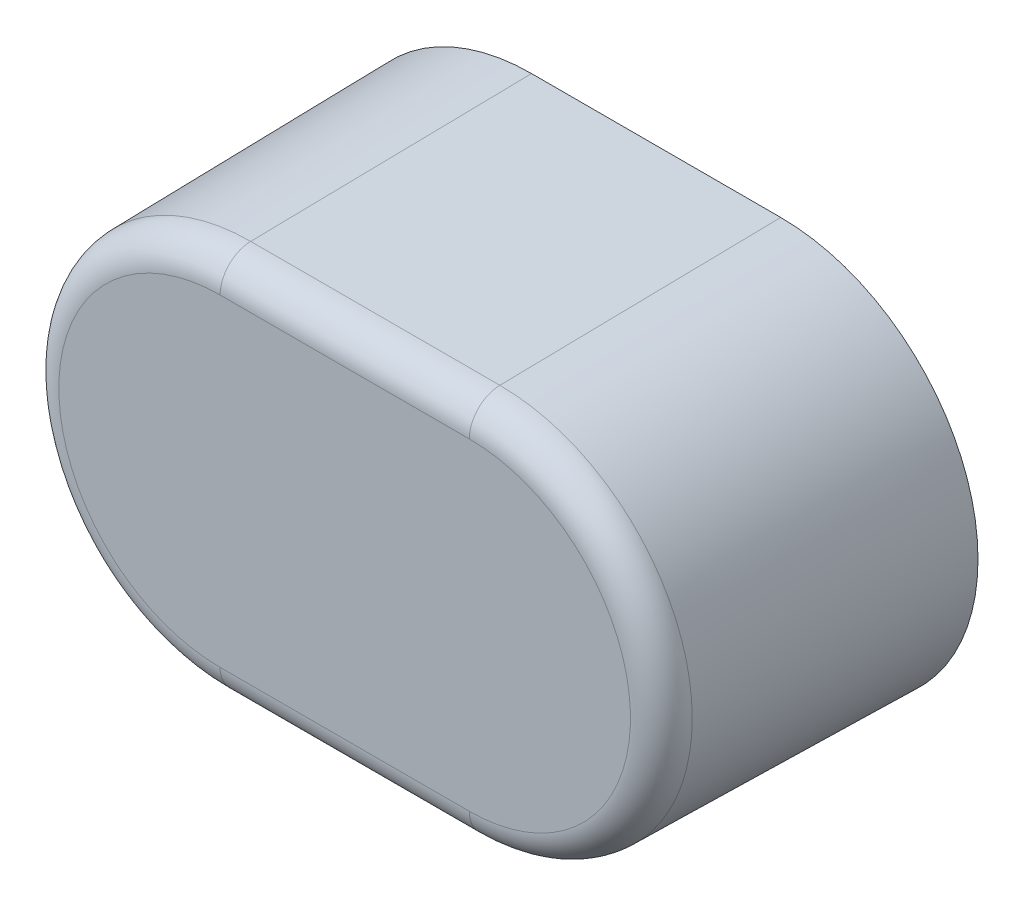
ISO-10303-21;
HEADER;
FILE_DESCRIPTION(('STEP AP214'),'2;1');
FILE_NAME('part.step','',(''),(''),'','','');
FILE_SCHEMA(('AUTOMOTIVE_DESIGN { 1 0 10303 214 1 1 1 1 }'));
ENDSEC;
DATA;
#1=APPLICATION_CONTEXT('core data for automotive mechanical design processes');
#2=APPLICATION_PROTOCOL_DEFINITION('international standard','automotive_design',2000,#1);
#3=PRODUCT_CONTEXT('',#1,'mechanical');
#4=PRODUCT('Part','Part','',(#3));
#5=PRODUCT_RELATED_PRODUCT_CATEGORY('part','',(#4));
#6=PRODUCT_DEFINITION_FORMATION('','',#4);
#7=PRODUCT_DEFINITION_CONTEXT('part definition',#1,'design');
#8=PRODUCT_DEFINITION('design','',#6,#7);
#9=PRODUCT_DEFINITION_SHAPE('','',#8);
#10=(LENGTH_UNIT() NAMED_UNIT(*) SI_UNIT(.MILLI.,.METRE.));
#11=(NAMED_UNIT(*) PLANE_ANGLE_UNIT() SI_UNIT($,.RADIAN.));
#12=(NAMED_UNIT(*) SI_UNIT($,.STERADIAN.) SOLID_ANGLE_UNIT());
#13=UNCERTAINTY_MEASURE_WITH_UNIT(LENGTH_MEASURE(1.E-05),#10,'distance_accuracy_value','');
#14=(GEOMETRIC_REPRESENTATION_CONTEXT(3) GLOBAL_UNCERTAINTY_ASSIGNED_CONTEXT((#13)) GLOBAL_UNIT_ASSIGNED_CONTEXT((#10,
#11,#12)) REPRESENTATION_CONTEXT('',''));
#15=CARTESIAN_POINT('',(0.,0.,0.));
#16=DIRECTION('',(0.,0.,1.));
#17=DIRECTION('',(1.,0.,0.));
#18=AXIS2_PLACEMENT_3D('',#15,#16,#17);
#19=CARTESIAN_POINT('',(0.,0.,2.5));
#20=DIRECTION('',(0.,0.,1.));
#21=DIRECTION('',(1.,0.,0.));
#22=AXIS2_PLACEMENT_3D('',#19,#20,#21);
#23=PLANE('',#22);
#24=DIRECTION('',(-0.999999997699824,6.78258914240069E-05,0.));
#25=VECTOR('',#24,1.);
#26=CARTESIAN_POINT('',(0.299947338418783,-0.776433159121861,2.5));
#27=LINE('',#26,#25);
#28=CARTESIAN_POINT('',(0.599947337728731,-0.776453506889288,2.5));
#29=VERTEX_POINT('',#28);
#30=CARTESIAN_POINT('',(-0.600052659511058,-0.776372115819579,2.5));
#31=VERTEX_POINT('',#30);
#32=EDGE_CURVE('E120',#29,#31,#27,.T.);
#33=ORIENTED_EDGE('',*,*,#32,.F.);
#34=CARTESIAN_POINT('',(0.599999998619895,-4.06955348541231E-05,2.5));
#35=DIRECTION('',(0.,0.,-1.));
#36=DIRECTION('',(6.78258914236833E-05,0.999999997699824,0.));
#37=AXIS2_PLACEMENT_3D('',#34,#35,#36);
#38=CIRCLE('',#37,0.77641281314032);
#39=CARTESIAN_POINT('',(0.600052659511059,0.77637211581958,2.5));
#40=VERTEX_POINT('',#39);
#41=EDGE_CURVE('E135',#40,#29,#38,.T.);
#42=ORIENTED_EDGE('',*,*,#41,.F.);
#43=DIRECTION('',(0.999999997699824,-6.78258914229661E-05,0.));
#44=VECTOR('',#43,1.);
#45=CARTESIAN_POINT('',(-0.299947338418783,0.77643315912186,2.5));
#46=LINE('',#45,#44);
#47=CARTESIAN_POINT('',(-0.599947337728731,0.776453506889287,2.5));
#48=VERTEX_POINT('',#47);
#49=EDGE_CURVE('E131',#48,#40,#46,.T.);
#50=ORIENTED_EDGE('',*,*,#49,.F.);
#51=CARTESIAN_POINT('',(-0.599999998619894,4.06955348541231E-05,2.5));
#52=DIRECTION('',(0.,0.,-1.));
#53=DIRECTION('',(-6.78258914235438E-05,-0.999999997699824,0.));
#54=AXIS2_PLACEMENT_3D('',#51,#52,#53);
#55=CIRCLE('',#54,0.776412813140319);
#56=EDGE_CURVE('E89',#31,#48,#55,.T.);
#57=ORIENTED_EDGE('',*,*,#56,.F.);
#58=EDGE_LOOP('',(#33,#42,#50,#57));
#59=FACE_BOUND('',#58,.T.);
#60=ADVANCED_FACE('F17',(#59),#23,.T.);
#61=CARTESIAN_POINT('',(0.299947338418783,-0.776433159121861,2.35));
#62=DIRECTION('',(-0.999999997699824,6.78258914240069E-05,0.));
#63=DIRECTION('',(-6.78258914240069E-05,-0.999999997699824,0.));
#64=AXIS2_PLACEMENT_3D('',#61,#62,#63);
#65=CYLINDRICAL_SURFACE('',#64,0.15);
#66=CARTESIAN_POINT('',(0.599947337728731,-0.776453506889288,2.35));
#67=DIRECTION('',(-0.999999997699824,6.78258914235049E-05,0.));
#68=DIRECTION('',(-6.78258914235049E-05,-0.999999997699824,0.));
#69=AXIS2_PLACEMENT_3D('',#66,#67,#68);
#70=CIRCLE('',#69,0.15);
#71=CARTESIAN_POINT('',(0.599936765051672,-0.926430660790236,2.35261786099289));
#72=VERTEX_POINT('',#71);
#73=EDGE_CURVE('E128',#29,#72,#70,.F.);
#74=ORIENTED_EDGE('',*,*,#73,.F.);
#75=ORIENTED_EDGE('',*,*,#32,.T.);
#76=CARTESIAN_POINT('',(-0.600052659511058,-0.776372115819579,2.35));
#77=DIRECTION('',(-0.999999997699824,6.78258914235049E-05,0.));
#78=DIRECTION('',(-6.78258914235049E-05,-0.999999997699824,0.));
#79=AXIS2_PLACEMENT_3D('',#76,#77,#78);
#80=CIRCLE('',#79,0.15);
#81=CARTESIAN_POINT('',(-0.600062831845239,-0.926349275945284,2.35261750592995));
#82=VERTEX_POINT('',#81);
#83=EDGE_CURVE('E101',#82,#31,#80,.T.);
#84=ORIENTED_EDGE('',*,*,#83,.F.);
#85=DIRECTION('',(0.999999997700525,-6.78052325737288E-05,1.18354473976969E-06));
#86=VECTOR('',#85,1.);
#87=CARTESIAN_POINT('',(0.599935564023042,-0.926430660709192,2.35261786096369));
#88=LINE('',#87,#86);
#89=EDGE_CURVE('E87',#72,#82,#88,.F.);
#90=ORIENTED_EDGE('',*,*,#89,.F.);
#91=EDGE_LOOP('',(#74,#75,#84,#90));
#92=FACE_BOUND('',#91,.T.);
#93=ADVANCED_FACE('F156',(#92),#65,.T.);
#94=CARTESIAN_POINT('',(0.599999998619895,-4.06955348541231E-05,2.35));
#95=DIRECTION('',(0.,0.,-1.));
#96=DIRECTION('',(-1.,0.,0.));
#97=AXIS2_PLACEMENT_3D('',#94,#95,#96);
#98=TOROIDAL_SURFACE('',#97,0.77641281314032,0.15);
#99=CARTESIAN_POINT('',(0.600052659511059,0.776372115819579,2.35));
#100=DIRECTION('',(0.999999997699824,-6.78258914229661E-05,0.));
#101=DIRECTION('',(6.78258914229661E-05,0.999999997699824,0.));
#102=AXIS2_PLACEMENT_3D('',#99,#100,#101);
#103=CIRCLE('',#102,0.15);
#104=CARTESIAN_POINT('',(0.600062831844821,0.926349282143179,2.35261715084553));
#105=VERTEX_POINT('',#104);
#106=EDGE_CURVE('E134',#40,#105,#103,.F.);
#107=ORIENTED_EDGE('',*,*,#106,.F.);
#108=ORIENTED_EDGE('',*,*,#41,.T.);
#109=ORIENTED_EDGE('',*,*,#73,.T.);
#110=CARTESIAN_POINT('',(0.599999998619895,-4.06955348541231E-05,2.35261786099272));
#111=DIRECTION('',(0.,0.,-1.));
#112=DIRECTION('',(-6.78258914239965E-05,-0.999999997699824,0.));
#113=AXIS2_PLACEMENT_3D('',#110,#111,#112);
#114=CIRCLE('',#113,0.926389967412996);
#115=EDGE_CURVE('E55',#105,#72,#114,.T.);
#116=ORIENTED_EDGE('',*,*,#115,.F.);
#117=EDGE_LOOP('',(#107,#108,#109,#116));
#118=FACE_BOUND('',#117,.T.);
#119=ADVANCED_FACE('F147',(#118),#98,.T.);
#120=CARTESIAN_POINT('',(-0.299947338418783,0.77643315912186,2.35));
#121=DIRECTION('',(0.999999997699824,-6.78258914229661E-05,0.));
#122=DIRECTION('',(6.78258914229661E-05,0.999999997699824,0.));
#123=AXIS2_PLACEMENT_3D('',#120,#121,#122);
#124=CYLINDRICAL_SURFACE('',#123,0.15);
#125=ORIENTED_EDGE('',*,*,#106,.T.);
#126=DIRECTION('',(0.999999997700525,-6.78052325726883E-05,-1.18354473975153E-06));
#127=VECTOR('',#126,1.);
#128=CARTESIAN_POINT('',(-0.599935564023042,0.926430660709191,2.35261786096369));
#129=LINE('',#128,#127);
#130=CARTESIAN_POINT('',(-0.599937165394549,0.926430660817381,2.35261786099337));
#131=VERTEX_POINT('',#130);
#132=EDGE_CURVE('E60',#131,#105,#129,.T.);
#133=ORIENTED_EDGE('',*,*,#132,.F.);
#134=CARTESIAN_POINT('',(-0.599947337728731,0.776453506889287,2.35));
#135=DIRECTION('',(0.999999997699824,-6.78258914222951E-05,0.));
#136=DIRECTION('',(6.78258914222951E-05,0.999999997699824,0.));
#137=AXIS2_PLACEMENT_3D('',#134,#135,#136);
#138=CIRCLE('',#137,0.15);
#139=EDGE_CURVE('E193',#48,#131,#138,.F.);
#140=ORIENTED_EDGE('',*,*,#139,.F.);
#141=ORIENTED_EDGE('',*,*,#49,.T.);
#142=EDGE_LOOP('',(#125,#133,#140,#141));
#143=FACE_BOUND('',#142,.T.);
#144=ADVANCED_FACE('F109',(#143),#124,.T.);
#145=CARTESIAN_POINT('',(-0.599999998619894,4.06955348541231E-05,2.35));
#146=DIRECTION('',(0.,0.,-1.));
#147=DIRECTION('',(-1.,0.,0.));
#148=AXIS2_PLACEMENT_3D('',#145,#146,#147);
#149=TOROIDAL_SURFACE('',#148,0.776412813140319,0.15);
#150=ORIENTED_EDGE('',*,*,#83,.T.);
#151=ORIENTED_EDGE('',*,*,#56,.T.);
#152=ORIENTED_EDGE('',*,*,#139,.T.);
#153=CARTESIAN_POINT('',(-0.599999998619894,4.06955348541231E-05,2.35261786099272));
#154=DIRECTION('',(0.,0.,-1.));
#155=DIRECTION('',(6.78258914231772E-05,0.999999997699824,0.));
#156=AXIS2_PLACEMENT_3D('',#153,#154,#155);
#157=CIRCLE('',#156,0.926389967412996);
#158=EDGE_CURVE('E76',#82,#131,#157,.T.);
#159=ORIENTED_EDGE('',*,*,#158,.F.);
#160=EDGE_LOOP('',(#150,#151,#152,#159));
#161=FACE_BOUND('',#160,.T.);
#162=ADVANCED_FACE('F104',(#161),#149,.T.);
#163=CARTESIAN_POINT('',(0.599935564023042,-0.950040693349687,1.));
#164=DIRECTION('',(-6.7815561212221E-05,-0.999847692856566,0.0174524064372835));
#165=DIRECTION('',(0.,-0.0174524064774149,-0.999847695155691));
#166=AXIS2_PLACEMENT_3D('',#163,#164,#165);
#167=PLANE('',#166);
#168=DIRECTION('',(0.999999997699824,-6.78258914241045E-05,0.));
#169=VECTOR('',#168,1.);
#170=CARTESIAN_POINT('',(-0.600064433216746,-0.949959302279978,1.));
#171=LINE('',#170,#169);
#172=CARTESIAN_POINT('',(-0.600064433216746,-0.949959302278704,0.999999999982265));
#173=VERTEX_POINT('',#172);
#174=CARTESIAN_POINT('',(0.599935564023042,-0.95004069334944,0.999999999982265));
#175=VERTEX_POINT('',#174);
#176=EDGE_CURVE('E65',#173,#175,#171,.T.);
#177=ORIENTED_EDGE('',*,*,#176,.T.);
#178=DIRECTION('',(1.18372502410246E-06,0.0174524063971399,0.999847695156391));
#179=VECTOR('',#178,1.);
#180=CARTESIAN_POINT('',(0.00916561614637101,-8711.04487490411,-499000.));
#181=LINE('',#180,#179);
#182=EDGE_CURVE('E49',#72,#175,#181,.F.);
#183=ORIENTED_EDGE('',*,*,#182,.F.);
#184=ORIENTED_EDGE('',*,*,#89,.T.);
#185=DIRECTION('',(1.18372502408638E-06,0.0174524063971399,0.999847695156391));
#186=VECTOR('',#185,1.);
#187=CARTESIAN_POINT('',(-1.19083438108539,-8711.04479351304,-499000.));
#188=LINE('',#187,#186);
#189=EDGE_CURVE('E70',#173,#82,#188,.T.);
#190=ORIENTED_EDGE('',*,*,#189,.F.);
#191=EDGE_LOOP('',(#177,#183,#184,#190));
#192=FACE_BOUND('',#191,.T.);
#193=ADVANCED_FACE('F68',(#192),#167,.T.);
#194=CARTESIAN_POINT('',(0.599999998619895,-4.06955348541374E-05,0.999999999976353));
#195=DIRECTION('',(0.,0.,-1.));
#196=DIRECTION('',(-1.,0.,0.));
#197=AXIS2_PLACEMENT_3D('',#194,#195,#196);
#198=CONICAL_SURFACE('',#197,0.94999999999901,0.0174532925184018);
#199=CARTESIAN_POINT('',(0.599999998619895,-4.06955348541374E-05,0.999999999976353));
#200=DIRECTION('',(0.,0.,-1.));
#201=DIRECTION('',(-1.,0.,0.));
#202=AXIS2_PLACEMENT_3D('',#199,#200,#201);
#203=CIRCLE('',#202,0.94999999999901);
#204=CARTESIAN_POINT('',(0.600063632530994,0.949959302334285,0.999999999988177));
#205=VERTEX_POINT('',#204);
#206=EDGE_CURVE('E21',#175,#205,#203,.F.);
#207=ORIENTED_EDGE('',*,*,#206,.T.);
#208=DIRECTION('',(0.,-0.017452406477415,0.999847695155691));
#209=VECTOR('',#208,1.);
#210=CARTESIAN_POINT('',(0.600062831845241,0.94995932717918,0.999998579748207));
#211=LINE('',#210,#209);
#212=EDGE_CURVE('E81',#105,#205,#211,.F.);
#213=ORIENTED_EDGE('',*,*,#212,.F.);
#214=ORIENTED_EDGE('',*,*,#115,.T.);
#215=ORIENTED_EDGE('',*,*,#182,.T.);
#216=EDGE_LOOP('',(#207,#213,#214,#215));
#217=FACE_BOUND('',#216,.T.);
#218=ADVANCED_FACE('F51',(#217),#198,.T.);
#219=CARTESIAN_POINT('',(-0.599935564023042,0.950040693349686,1.));
#220=DIRECTION('',(6.78155612111803E-05,0.999847692856566,0.0174524064372836));
#221=DIRECTION('',(0.,-0.017452406477415,0.999847695155691));
#222=AXIS2_PLACEMENT_3D('',#219,#220,#221);
#223=PLANE('',#222);
#224=DIRECTION('',(-0.999999997699824,6.78258914232913E-05,0.));
#225=VECTOR('',#224,1.);
#226=CARTESIAN_POINT('',(0.600064433216747,0.949959302279978,1.));
#227=LINE('',#226,#225);
#228=CARTESIAN_POINT('',(-0.599935564023042,0.950040693349439,0.999999999996476));
#229=VERTEX_POINT('',#228);
#230=EDGE_CURVE('E27',#205,#229,#227,.T.);
#231=ORIENTED_EDGE('',*,*,#230,.T.);
#232=DIRECTION('',(-1.18372502408852E-06,-0.0174524063971399,0.999847695156391));
#233=VECTOR('',#232,1.);
#234=CARTESIAN_POINT('',(-0.00916561615332855,8711.04487490411,-499000.));
#235=LINE('',#234,#233);
#236=EDGE_CURVE('E33',#131,#229,#235,.F.);
#237=ORIENTED_EDGE('',*,*,#236,.F.);
#238=ORIENTED_EDGE('',*,*,#132,.T.);
#239=ORIENTED_EDGE('',*,*,#212,.T.);
#240=EDGE_LOOP('',(#231,#237,#238,#239));
#241=FACE_BOUND('',#240,.T.);
#242=ADVANCED_FACE('F210',(#241),#223,.T.);
#243=CARTESIAN_POINT('',(-0.599999998619894,4.06955348541374E-05,0.999999999976353));
#244=DIRECTION('',(0.,0.,-1.));
#245=DIRECTION('',(-1.,0.,0.));
#246=AXIS2_PLACEMENT_3D('',#243,#244,#245);
#247=CONICAL_SURFACE('',#246,0.94999999999901,0.0174532925184018);
#248=CARTESIAN_POINT('',(-0.599999998619894,4.06955348541374E-05,0.999999999976353));
#249=DIRECTION('',(0.,0.,-1.));
#250=DIRECTION('',(-1.,0.,0.));
#251=AXIS2_PLACEMENT_3D('',#248,#249,#250);
#252=CIRCLE('',#251,0.94999999999901);
#253=EDGE_CURVE('E11',#229,#173,#252,.F.);
#254=ORIENTED_EDGE('',*,*,#253,.T.);
#255=ORIENTED_EDGE('',*,*,#189,.T.);
#256=ORIENTED_EDGE('',*,*,#158,.T.);
#257=ORIENTED_EDGE('',*,*,#236,.T.);
#258=EDGE_LOOP('',(#254,#255,#256,#257));
#259=FACE_BOUND('',#258,.T.);
#260=ADVANCED_FACE('F215',(#259),#247,.T.);
#261=CARTESIAN_POINT('',(0.,0.,1.));
#262=DIRECTION('',(0.,0.,1.));
#263=DIRECTION('',(1.,0.,0.));
#264=AXIS2_PLACEMENT_3D('',#261,#262,#263);
#265=PLANE('',#264);
#266=ORIENTED_EDGE('',*,*,#230,.F.);
#267=ORIENTED_EDGE('',*,*,#206,.F.);
#268=ORIENTED_EDGE('',*,*,#176,.F.);
#269=ORIENTED_EDGE('',*,*,#253,.F.);
#270=EDGE_LOOP('',(#266,#267,#268,#269));
#271=FACE_BOUND('',#270,.T.);
#272=ADVANCED_FACE('F64',(#271),#265,.F.);
#273=CLOSED_SHELL('',(#60,#93,#119,#144,#162,#193,#218,#242,#260,#272));
#274=MANIFOLD_SOLID_BREP('B1',#273);
#275=ADVANCED_BREP_SHAPE_REPRESENTATION('',(#18,#274),#14);
#276=SHAPE_DEFINITION_REPRESENTATION(#9,#275);
ENDSEC;
END-ISO-10303-21;
